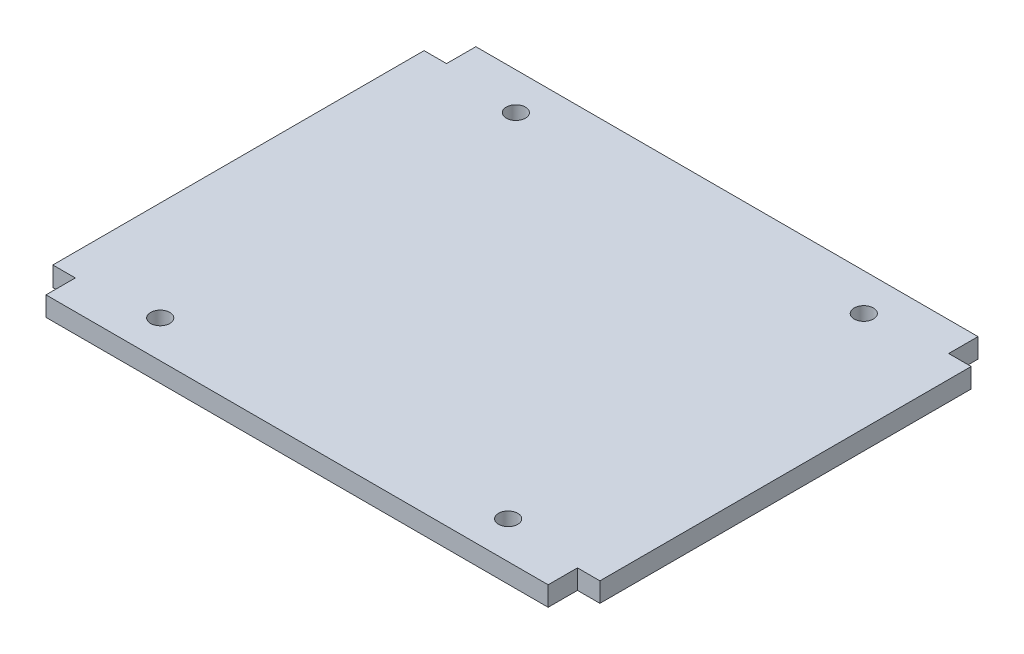
ISO-10303-21;
HEADER;
FILE_DESCRIPTION(('STEP AP214'),'2;1');
FILE_NAME('part.step','',(''),(''),'','','');
FILE_SCHEMA(('AUTOMOTIVE_DESIGN { 1 0 10303 214 1 1 1 1 }'));
ENDSEC;
DATA;
#1=APPLICATION_CONTEXT('core data for automotive mechanical design processes');
#2=APPLICATION_PROTOCOL_DEFINITION('international standard','automotive_design',2000,#1);
#3=PRODUCT_CONTEXT('',#1,'mechanical');
#4=PRODUCT('Part','Part','',(#3));
#5=PRODUCT_RELATED_PRODUCT_CATEGORY('part','',(#4));
#6=PRODUCT_DEFINITION_FORMATION('','',#4);
#7=PRODUCT_DEFINITION_CONTEXT('part definition',#1,'design');
#8=PRODUCT_DEFINITION('design','',#6,#7);
#9=PRODUCT_DEFINITION_SHAPE('','',#8);
#10=(LENGTH_UNIT() NAMED_UNIT(*) SI_UNIT(.MILLI.,.METRE.));
#11=(NAMED_UNIT(*) PLANE_ANGLE_UNIT() SI_UNIT($,.RADIAN.));
#12=(NAMED_UNIT(*) SI_UNIT($,.STERADIAN.) SOLID_ANGLE_UNIT());
#13=UNCERTAINTY_MEASURE_WITH_UNIT(LENGTH_MEASURE(1.E-05),#10,'distance_accuracy_value','');
#14=(GEOMETRIC_REPRESENTATION_CONTEXT(3) GLOBAL_UNCERTAINTY_ASSIGNED_CONTEXT((#13)) GLOBAL_UNIT_ASSIGNED_CONTEXT((#10,
#11,#12)) REPRESENTATION_CONTEXT('',''));
#15=CARTESIAN_POINT('',(0.,0.,0.));
#16=DIRECTION('',(0.,0.,1.));
#17=DIRECTION('',(1.,0.,0.));
#18=AXIS2_PLACEMENT_3D('',#15,#16,#17);
#19=CARTESIAN_POINT('',(0.,1.27,0.));
#20=DIRECTION('',(0.,-1.,0.));
#21=DIRECTION('',(0.,0.,-1.));
#22=AXIS2_PLACEMENT_3D('',#19,#20,#21);
#23=PLANE('',#22);
#24=DIRECTION('',(0.,0.,-1.));
#25=VECTOR('',#24,1.);
#26=CARTESIAN_POINT('',(32.639,1.27,-24.13));
#27=LINE('',#26,#25);
#28=CARTESIAN_POINT('',(32.639,1.27,-24.13));
#29=VERTEX_POINT('',#28);
#30=CARTESIAN_POINT('',(32.639,1.27,-27.94));
#31=VERTEX_POINT('',#30);
#32=EDGE_CURVE('E177',#29,#31,#27,.T.);
#33=ORIENTED_EDGE('',*,*,#32,.T.);
#34=DIRECTION('',(-1.,0.,0.));
#35=VECTOR('',#34,1.);
#36=CARTESIAN_POINT('',(-32.639,1.27,-27.94));
#37=LINE('',#36,#35);
#38=CARTESIAN_POINT('',(-32.639,1.27,-27.94));
#39=VERTEX_POINT('',#38);
#40=EDGE_CURVE('E105',#31,#39,#37,.T.);
#41=ORIENTED_EDGE('',*,*,#40,.T.);
#42=DIRECTION('',(0.,0.,1.));
#43=VECTOR('',#42,1.);
#44=CARTESIAN_POINT('',(-32.639,1.27,-24.13));
#45=LINE('',#44,#43);
#46=CARTESIAN_POINT('',(-32.639,1.27,-24.13));
#47=VERTEX_POINT('',#46);
#48=EDGE_CURVE('E204',#39,#47,#45,.T.);
#49=ORIENTED_EDGE('',*,*,#48,.T.);
#50=DIRECTION('',(-1.,0.,0.));
#51=VECTOR('',#50,1.);
#52=CARTESIAN_POINT('',(-32.639,1.27,-24.13));
#53=LINE('',#52,#51);
#54=CARTESIAN_POINT('',(-35.56,1.27,-24.13));
#55=VERTEX_POINT('',#54);
#56=EDGE_CURVE('E223',#47,#55,#53,.T.);
#57=ORIENTED_EDGE('',*,*,#56,.T.);
#58=DIRECTION('',(0.,0.,1.));
#59=VECTOR('',#58,1.);
#60=CARTESIAN_POINT('',(-35.56,1.27,-24.13));
#61=LINE('',#60,#59);
#62=CARTESIAN_POINT('',(-35.56,1.27,24.13));
#63=VERTEX_POINT('',#62);
#64=EDGE_CURVE('E220',#55,#63,#61,.T.);
#65=ORIENTED_EDGE('',*,*,#64,.T.);
#66=DIRECTION('',(1.,0.,0.));
#67=VECTOR('',#66,1.);
#68=CARTESIAN_POINT('',(-32.639,1.27,24.13));
#69=LINE('',#68,#67);
#70=CARTESIAN_POINT('',(-32.639,1.27,24.13));
#71=VERTEX_POINT('',#70);
#72=EDGE_CURVE('E222',#63,#71,#69,.T.);
#73=ORIENTED_EDGE('',*,*,#72,.T.);
#74=DIRECTION('',(0.,0.,1.));
#75=VECTOR('',#74,1.);
#76=CARTESIAN_POINT('',(-32.639,1.27,27.94));
#77=LINE('',#76,#75);
#78=CARTESIAN_POINT('',(-32.639,1.27,27.94));
#79=VERTEX_POINT('',#78);
#80=EDGE_CURVE('E225',#71,#79,#77,.T.);
#81=ORIENTED_EDGE('',*,*,#80,.T.);
#82=DIRECTION('',(1.,0.,0.));
#83=VECTOR('',#82,1.);
#84=CARTESIAN_POINT('',(-32.639,1.27,27.94));
#85=LINE('',#84,#83);
#86=CARTESIAN_POINT('',(32.639,1.27,27.94));
#87=VERTEX_POINT('',#86);
#88=EDGE_CURVE('E231',#79,#87,#85,.T.);
#89=ORIENTED_EDGE('',*,*,#88,.T.);
#90=DIRECTION('',(0.,0.,-1.));
#91=VECTOR('',#90,1.);
#92=CARTESIAN_POINT('',(32.639,1.27,27.94));
#93=LINE('',#92,#91);
#94=CARTESIAN_POINT('',(32.639,1.27,24.13));
#95=VERTEX_POINT('',#94);
#96=EDGE_CURVE('E136',#87,#95,#93,.T.);
#97=ORIENTED_EDGE('',*,*,#96,.T.);
#98=DIRECTION('',(1.,0.,0.));
#99=VECTOR('',#98,1.);
#100=CARTESIAN_POINT('',(32.639,1.27,24.13));
#101=LINE('',#100,#99);
#102=CARTESIAN_POINT('',(35.56,1.27,24.13));
#103=VERTEX_POINT('',#102);
#104=EDGE_CURVE('E130',#95,#103,#101,.T.);
#105=ORIENTED_EDGE('',*,*,#104,.T.);
#106=DIRECTION('',(0.,0.,-1.));
#107=VECTOR('',#106,1.);
#108=CARTESIAN_POINT('',(35.56,1.27,-24.13));
#109=LINE('',#108,#107);
#110=CARTESIAN_POINT('',(35.56,1.27,-24.13));
#111=VERTEX_POINT('',#110);
#112=EDGE_CURVE('E134',#103,#111,#109,.T.);
#113=ORIENTED_EDGE('',*,*,#112,.T.);
#114=DIRECTION('',(-1.,0.,0.));
#115=VECTOR('',#114,1.);
#116=CARTESIAN_POINT('',(32.639,1.27,-24.13));
#117=LINE('',#116,#115);
#118=EDGE_CURVE('E50',#111,#29,#117,.T.);
#119=ORIENTED_EDGE('',*,*,#118,.T.);
#120=EDGE_LOOP('',(#33,#41,#49,#57,#65,#73,#81,#89,#97,#105,#113,#119));
#121=FACE_BOUND('',#120,.T.);
#122=CARTESIAN_POINT('',(-22.615,1.27,-23.115));
#123=DIRECTION('',(0.,1.,0.));
#124=DIRECTION('',(0.,0.,1.));
#125=AXIS2_PLACEMENT_3D('',#122,#123,#124);
#126=CIRCLE('',#125,1.25);
#127=CARTESIAN_POINT('',(-22.615,1.27,-21.865));
#128=VERTEX_POINT('',#127);
#129=EDGE_CURVE('E158',#128,#128,#126,.T.);
#130=ORIENTED_EDGE('',*,*,#129,.F.);
#131=EDGE_LOOP('',(#130));
#132=FACE_BOUND('',#131,.T.);
#133=CARTESIAN_POINT('',(22.615,1.27,-23.115));
#134=DIRECTION('',(0.,1.,0.));
#135=DIRECTION('',(0.,0.,1.));
#136=AXIS2_PLACEMENT_3D('',#133,#134,#135);
#137=CIRCLE('',#136,1.25);
#138=CARTESIAN_POINT('',(22.615,1.27,-21.865));
#139=VERTEX_POINT('',#138);
#140=EDGE_CURVE('E295',#139,#139,#137,.T.);
#141=ORIENTED_EDGE('',*,*,#140,.F.);
#142=EDGE_LOOP('',(#141));
#143=FACE_BOUND('',#142,.T.);
#144=CARTESIAN_POINT('',(22.615,1.27,23.115));
#145=DIRECTION('',(0.,1.,0.));
#146=DIRECTION('',(0.,0.,-1.));
#147=AXIS2_PLACEMENT_3D('',#144,#145,#146);
#148=CIRCLE('',#147,1.25);
#149=CARTESIAN_POINT('',(22.615,1.27,21.865));
#150=VERTEX_POINT('',#149);
#151=EDGE_CURVE('E289',#150,#150,#148,.T.);
#152=ORIENTED_EDGE('',*,*,#151,.F.);
#153=EDGE_LOOP('',(#152));
#154=FACE_BOUND('',#153,.T.);
#155=CARTESIAN_POINT('',(-22.615,1.27,23.115));
#156=DIRECTION('',(0.,1.,0.));
#157=DIRECTION('',(0.,0.,-1.));
#158=AXIS2_PLACEMENT_3D('',#155,#156,#157);
#159=CIRCLE('',#158,1.25);
#160=CARTESIAN_POINT('',(-22.615,1.27,21.865));
#161=VERTEX_POINT('',#160);
#162=EDGE_CURVE('E280',#161,#161,#159,.T.);
#163=ORIENTED_EDGE('',*,*,#162,.F.);
#164=EDGE_LOOP('',(#163));
#165=FACE_BOUND('',#164,.T.);
#166=ADVANCED_FACE('F33',(#121,#132,#143,#154,#165),#23,.F.);
#167=CARTESIAN_POINT('',(0.,-1.27,0.));
#168=DIRECTION('',(0.,-1.,0.));
#169=DIRECTION('',(0.,0.,-1.));
#170=AXIS2_PLACEMENT_3D('',#167,#168,#169);
#171=PLANE('',#170);
#172=CARTESIAN_POINT('',(22.615,-1.27,23.115));
#173=DIRECTION('',(0.,1.,0.));
#174=DIRECTION('',(0.,0.,-1.));
#175=AXIS2_PLACEMENT_3D('',#172,#173,#174);
#176=CIRCLE('',#175,1.25);
#177=CARTESIAN_POINT('',(22.615,-1.27,21.865));
#178=VERTEX_POINT('',#177);
#179=EDGE_CURVE('E286',#178,#178,#176,.T.);
#180=ORIENTED_EDGE('',*,*,#179,.T.);
#181=EDGE_LOOP('',(#180));
#182=FACE_BOUND('',#181,.T.);
#183=CARTESIAN_POINT('',(-22.615,-1.27,-23.115));
#184=DIRECTION('',(0.,1.,0.));
#185=DIRECTION('',(0.,0.,1.));
#186=AXIS2_PLACEMENT_3D('',#183,#184,#185);
#187=CIRCLE('',#186,1.25);
#188=CARTESIAN_POINT('',(-22.615,-1.27,-21.865));
#189=VERTEX_POINT('',#188);
#190=EDGE_CURVE('E298',#189,#189,#187,.T.);
#191=ORIENTED_EDGE('',*,*,#190,.T.);
#192=EDGE_LOOP('',(#191));
#193=FACE_BOUND('',#192,.T.);
#194=DIRECTION('',(0.,0.,-1.));
#195=VECTOR('',#194,1.);
#196=CARTESIAN_POINT('',(32.639,-1.27,-24.13));
#197=LINE('',#196,#195);
#198=CARTESIAN_POINT('',(32.639,-1.27,-24.13));
#199=VERTEX_POINT('',#198);
#200=CARTESIAN_POINT('',(32.639,-1.27,-27.94));
#201=VERTEX_POINT('',#200);
#202=EDGE_CURVE('E154',#199,#201,#197,.T.);
#203=ORIENTED_EDGE('',*,*,#202,.F.);
#204=DIRECTION('',(-1.,0.,0.));
#205=VECTOR('',#204,1.);
#206=CARTESIAN_POINT('',(32.639,-1.27,-24.13));
#207=LINE('',#206,#205);
#208=CARTESIAN_POINT('',(35.56,-1.27,-24.13));
#209=VERTEX_POINT('',#208);
#210=EDGE_CURVE('E97',#209,#199,#207,.T.);
#211=ORIENTED_EDGE('',*,*,#210,.F.);
#212=DIRECTION('',(0.,0.,-1.));
#213=VECTOR('',#212,1.);
#214=CARTESIAN_POINT('',(35.56,-1.27,-24.13));
#215=LINE('',#214,#213);
#216=CARTESIAN_POINT('',(35.56,-1.27,24.13));
#217=VERTEX_POINT('',#216);
#218=EDGE_CURVE('E91',#217,#209,#215,.T.);
#219=ORIENTED_EDGE('',*,*,#218,.F.);
#220=DIRECTION('',(1.,0.,0.));
#221=VECTOR('',#220,1.);
#222=CARTESIAN_POINT('',(32.639,-1.27,24.13));
#223=LINE('',#222,#221);
#224=CARTESIAN_POINT('',(32.639,-1.27,24.13));
#225=VERTEX_POINT('',#224);
#226=EDGE_CURVE('E144',#225,#217,#223,.T.);
#227=ORIENTED_EDGE('',*,*,#226,.F.);
#228=DIRECTION('',(0.,0.,-1.));
#229=VECTOR('',#228,1.);
#230=CARTESIAN_POINT('',(32.639,-1.27,27.94));
#231=LINE('',#230,#229);
#232=CARTESIAN_POINT('',(32.639,-1.27,27.94));
#233=VERTEX_POINT('',#232);
#234=EDGE_CURVE('E172',#233,#225,#231,.T.);
#235=ORIENTED_EDGE('',*,*,#234,.F.);
#236=DIRECTION('',(1.,0.,0.));
#237=VECTOR('',#236,1.);
#238=CARTESIAN_POINT('',(-32.639,-1.27,27.94));
#239=LINE('',#238,#237);
#240=CARTESIAN_POINT('',(-32.639,-1.27,27.94));
#241=VERTEX_POINT('',#240);
#242=EDGE_CURVE('E170',#241,#233,#239,.T.);
#243=ORIENTED_EDGE('',*,*,#242,.F.);
#244=DIRECTION('',(0.,0.,1.));
#245=VECTOR('',#244,1.);
#246=CARTESIAN_POINT('',(-32.639,-1.27,27.94));
#247=LINE('',#246,#245);
#248=CARTESIAN_POINT('',(-32.639,-1.27,24.13));
#249=VERTEX_POINT('',#248);
#250=EDGE_CURVE('E168',#249,#241,#247,.T.);
#251=ORIENTED_EDGE('',*,*,#250,.F.);
#252=DIRECTION('',(1.,0.,0.));
#253=VECTOR('',#252,1.);
#254=CARTESIAN_POINT('',(-32.639,-1.27,24.13));
#255=LINE('',#254,#253);
#256=CARTESIAN_POINT('',(-35.56,-1.27,24.13));
#257=VERTEX_POINT('',#256);
#258=EDGE_CURVE('E166',#257,#249,#255,.T.);
#259=ORIENTED_EDGE('',*,*,#258,.F.);
#260=DIRECTION('',(0.,0.,1.));
#261=VECTOR('',#260,1.);
#262=CARTESIAN_POINT('',(-35.56,-1.27,-24.13));
#263=LINE('',#262,#261);
#264=CARTESIAN_POINT('',(-35.56,-1.27,-24.13));
#265=VERTEX_POINT('',#264);
#266=EDGE_CURVE('E164',#265,#257,#263,.T.);
#267=ORIENTED_EDGE('',*,*,#266,.F.);
#268=DIRECTION('',(-1.,0.,0.));
#269=VECTOR('',#268,1.);
#270=CARTESIAN_POINT('',(-32.639,-1.27,-24.13));
#271=LINE('',#270,#269);
#272=CARTESIAN_POINT('',(-32.639,-1.27,-24.13));
#273=VERTEX_POINT('',#272);
#274=EDGE_CURVE('E162',#273,#265,#271,.T.);
#275=ORIENTED_EDGE('',*,*,#274,.F.);
#276=DIRECTION('',(0.,0.,1.));
#277=VECTOR('',#276,1.);
#278=CARTESIAN_POINT('',(-32.639,-1.27,-24.13));
#279=LINE('',#278,#277);
#280=CARTESIAN_POINT('',(-32.639,-1.27,-27.94));
#281=VERTEX_POINT('',#280);
#282=EDGE_CURVE('E160',#281,#273,#279,.T.);
#283=ORIENTED_EDGE('',*,*,#282,.F.);
#284=DIRECTION('',(-1.,0.,0.));
#285=VECTOR('',#284,1.);
#286=CARTESIAN_POINT('',(-32.639,-1.27,-27.94));
#287=LINE('',#286,#285);
#288=EDGE_CURVE('E157',#201,#281,#287,.T.);
#289=ORIENTED_EDGE('',*,*,#288,.F.);
#290=EDGE_LOOP('',(#203,#211,#219,#227,#235,#243,#251,#259,#267,#275,#283,#289));
#291=FACE_BOUND('',#290,.T.);
#292=CARTESIAN_POINT('',(22.615,-1.27,-23.115));
#293=DIRECTION('',(0.,1.,0.));
#294=DIRECTION('',(0.,0.,1.));
#295=AXIS2_PLACEMENT_3D('',#292,#293,#294);
#296=CIRCLE('',#295,1.25);
#297=CARTESIAN_POINT('',(22.615,-1.27,-21.865));
#298=VERTEX_POINT('',#297);
#299=EDGE_CURVE('E292',#298,#298,#296,.T.);
#300=ORIENTED_EDGE('',*,*,#299,.T.);
#301=EDGE_LOOP('',(#300));
#302=FACE_BOUND('',#301,.T.);
#303=CARTESIAN_POINT('',(-22.615,-1.27,23.115));
#304=DIRECTION('',(0.,1.,0.));
#305=DIRECTION('',(0.,0.,-1.));
#306=AXIS2_PLACEMENT_3D('',#303,#304,#305);
#307=CIRCLE('',#306,1.25);
#308=CARTESIAN_POINT('',(-22.615,-1.27,21.865));
#309=VERTEX_POINT('',#308);
#310=EDGE_CURVE('E283',#309,#309,#307,.T.);
#311=ORIENTED_EDGE('',*,*,#310,.T.);
#312=EDGE_LOOP('',(#311));
#313=FACE_BOUND('',#312,.T.);
#314=ADVANCED_FACE('F208',(#182,#193,#291,#302,#313),#171,.T.);
#315=CARTESIAN_POINT('',(32.639,1.27,-24.13));
#316=DIRECTION('',(-1.,0.,0.));
#317=DIRECTION('',(0.,0.,1.));
#318=AXIS2_PLACEMENT_3D('',#315,#316,#317);
#319=PLANE('',#318);
#320=ORIENTED_EDGE('',*,*,#202,.T.);
#321=DIRECTION('',(0.,-1.,0.));
#322=VECTOR('',#321,1.);
#323=CARTESIAN_POINT('',(32.639,1.27,-27.94));
#324=LINE('',#323,#322);
#325=EDGE_CURVE('E11',#31,#201,#324,.T.);
#326=ORIENTED_EDGE('',*,*,#325,.F.);
#327=ORIENTED_EDGE('',*,*,#32,.F.);
#328=DIRECTION('',(0.,-1.,0.));
#329=VECTOR('',#328,1.);
#330=CARTESIAN_POINT('',(32.639,1.27,-24.13));
#331=LINE('',#330,#329);
#332=EDGE_CURVE('E150',#29,#199,#331,.T.);
#333=ORIENTED_EDGE('',*,*,#332,.T.);
#334=EDGE_LOOP('',(#320,#326,#327,#333));
#335=FACE_BOUND('',#334,.T.);
#336=ADVANCED_FACE('F35',(#335),#319,.F.);
#337=CARTESIAN_POINT('',(-32.639,1.27,-27.94));
#338=DIRECTION('',(0.,0.,1.));
#339=DIRECTION('',(1.,0.,0.));
#340=AXIS2_PLACEMENT_3D('',#337,#338,#339);
#341=PLANE('',#340);
#342=ORIENTED_EDGE('',*,*,#288,.T.);
#343=DIRECTION('',(0.,-1.,0.));
#344=VECTOR('',#343,1.);
#345=CARTESIAN_POINT('',(-32.639,1.27,-27.94));
#346=LINE('',#345,#344);
#347=EDGE_CURVE('E42',#39,#281,#346,.T.);
#348=ORIENTED_EDGE('',*,*,#347,.F.);
#349=ORIENTED_EDGE('',*,*,#40,.F.);
#350=ORIENTED_EDGE('',*,*,#325,.T.);
#351=EDGE_LOOP('',(#342,#348,#349,#350));
#352=FACE_BOUND('',#351,.T.);
#353=ADVANCED_FACE('F410',(#352),#341,.F.);
#354=CARTESIAN_POINT('',(-32.639,1.27,-24.13));
#355=DIRECTION('',(1.,0.,0.));
#356=DIRECTION('',(0.,0.,-1.));
#357=AXIS2_PLACEMENT_3D('',#354,#355,#356);
#358=PLANE('',#357);
#359=ORIENTED_EDGE('',*,*,#282,.T.);
#360=DIRECTION('',(0.,-1.,0.));
#361=VECTOR('',#360,1.);
#362=CARTESIAN_POINT('',(-32.639,1.27,-24.13));
#363=LINE('',#362,#361);
#364=EDGE_CURVE('E196',#47,#273,#363,.T.);
#365=ORIENTED_EDGE('',*,*,#364,.F.);
#366=ORIENTED_EDGE('',*,*,#48,.F.);
#367=ORIENTED_EDGE('',*,*,#347,.T.);
#368=EDGE_LOOP('',(#359,#365,#366,#367));
#369=FACE_BOUND('',#368,.T.);
#370=ADVANCED_FACE('F202',(#369),#358,.F.);
#371=CARTESIAN_POINT('',(-32.639,1.27,-24.13));
#372=DIRECTION('',(0.,0.,1.));
#373=DIRECTION('',(1.,0.,0.));
#374=AXIS2_PLACEMENT_3D('',#371,#372,#373);
#375=PLANE('',#374);
#376=ORIENTED_EDGE('',*,*,#274,.T.);
#377=DIRECTION('',(0.,-1.,0.));
#378=VECTOR('',#377,1.);
#379=CARTESIAN_POINT('',(-35.56,1.27,-24.13));
#380=LINE('',#379,#378);
#381=EDGE_CURVE('E193',#55,#265,#380,.T.);
#382=ORIENTED_EDGE('',*,*,#381,.F.);
#383=ORIENTED_EDGE('',*,*,#56,.F.);
#384=ORIENTED_EDGE('',*,*,#364,.T.);
#385=EDGE_LOOP('',(#376,#382,#383,#384));
#386=FACE_BOUND('',#385,.T.);
#387=ADVANCED_FACE('F214',(#386),#375,.F.);
#388=CARTESIAN_POINT('',(-35.56,1.27,-24.13));
#389=DIRECTION('',(1.,0.,0.));
#390=DIRECTION('',(0.,0.,-1.));
#391=AXIS2_PLACEMENT_3D('',#388,#389,#390);
#392=PLANE('',#391);
#393=ORIENTED_EDGE('',*,*,#266,.T.);
#394=DIRECTION('',(0.,-1.,0.));
#395=VECTOR('',#394,1.);
#396=CARTESIAN_POINT('',(-35.56,1.27,24.13));
#397=LINE('',#396,#395);
#398=EDGE_CURVE('E190',#63,#257,#397,.T.);
#399=ORIENTED_EDGE('',*,*,#398,.F.);
#400=ORIENTED_EDGE('',*,*,#64,.F.);
#401=ORIENTED_EDGE('',*,*,#381,.T.);
#402=EDGE_LOOP('',(#393,#399,#400,#401));
#403=FACE_BOUND('',#402,.T.);
#404=ADVANCED_FACE('F218',(#403),#392,.F.);
#405=CARTESIAN_POINT('',(-32.639,1.27,24.13));
#406=DIRECTION('',(0.,0.,-1.));
#407=DIRECTION('',(-1.,0.,0.));
#408=AXIS2_PLACEMENT_3D('',#405,#406,#407);
#409=PLANE('',#408);
#410=ORIENTED_EDGE('',*,*,#258,.T.);
#411=DIRECTION('',(0.,-1.,0.));
#412=VECTOR('',#411,1.);
#413=CARTESIAN_POINT('',(-32.639,1.27,24.13));
#414=LINE('',#413,#412);
#415=EDGE_CURVE('E187',#71,#249,#414,.T.);
#416=ORIENTED_EDGE('',*,*,#415,.F.);
#417=ORIENTED_EDGE('',*,*,#72,.F.);
#418=ORIENTED_EDGE('',*,*,#398,.T.);
#419=EDGE_LOOP('',(#410,#416,#417,#418));
#420=FACE_BOUND('',#419,.T.);
#421=ADVANCED_FACE('F375',(#420),#409,.F.);
#422=CARTESIAN_POINT('',(-32.639,1.27,27.94));
#423=DIRECTION('',(1.,0.,0.));
#424=DIRECTION('',(0.,0.,-1.));
#425=AXIS2_PLACEMENT_3D('',#422,#423,#424);
#426=PLANE('',#425);
#427=ORIENTED_EDGE('',*,*,#250,.T.);
#428=DIRECTION('',(0.,-1.,0.));
#429=VECTOR('',#428,1.);
#430=CARTESIAN_POINT('',(-32.639,1.27,27.94));
#431=LINE('',#430,#429);
#432=EDGE_CURVE('E184',#79,#241,#431,.T.);
#433=ORIENTED_EDGE('',*,*,#432,.F.);
#434=ORIENTED_EDGE('',*,*,#80,.F.);
#435=ORIENTED_EDGE('',*,*,#415,.T.);
#436=EDGE_LOOP('',(#427,#433,#434,#435));
#437=FACE_BOUND('',#436,.T.);
#438=ADVANCED_FACE('F366',(#437),#426,.F.);
#439=CARTESIAN_POINT('',(-32.639,1.27,27.94));
#440=DIRECTION('',(0.,0.,-1.));
#441=DIRECTION('',(-1.,0.,0.));
#442=AXIS2_PLACEMENT_3D('',#439,#440,#441);
#443=PLANE('',#442);
#444=ORIENTED_EDGE('',*,*,#242,.T.);
#445=DIRECTION('',(0.,-1.,0.));
#446=VECTOR('',#445,1.);
#447=CARTESIAN_POINT('',(32.639,1.27,27.94));
#448=LINE('',#447,#446);
#449=EDGE_CURVE('E181',#87,#233,#448,.T.);
#450=ORIENTED_EDGE('',*,*,#449,.F.);
#451=ORIENTED_EDGE('',*,*,#88,.F.);
#452=ORIENTED_EDGE('',*,*,#432,.T.);
#453=EDGE_LOOP('',(#444,#450,#451,#452));
#454=FACE_BOUND('',#453,.T.);
#455=ADVANCED_FACE('F237',(#454),#443,.F.);
#456=CARTESIAN_POINT('',(32.639,1.27,27.94));
#457=DIRECTION('',(-1.,0.,0.));
#458=DIRECTION('',(0.,0.,1.));
#459=AXIS2_PLACEMENT_3D('',#456,#457,#458);
#460=PLANE('',#459);
#461=ORIENTED_EDGE('',*,*,#234,.T.);
#462=DIRECTION('',(0.,-1.,0.));
#463=VECTOR('',#462,1.);
#464=CARTESIAN_POINT('',(32.639,1.27,24.13));
#465=LINE('',#464,#463);
#466=EDGE_CURVE('E145',#95,#225,#465,.T.);
#467=ORIENTED_EDGE('',*,*,#466,.F.);
#468=ORIENTED_EDGE('',*,*,#96,.F.);
#469=ORIENTED_EDGE('',*,*,#449,.T.);
#470=EDGE_LOOP('',(#461,#467,#468,#469));
#471=FACE_BOUND('',#470,.T.);
#472=ADVANCED_FACE('F241',(#471),#460,.F.);
#473=CARTESIAN_POINT('',(32.639,1.27,24.13));
#474=DIRECTION('',(0.,0.,-1.));
#475=DIRECTION('',(-1.,0.,0.));
#476=AXIS2_PLACEMENT_3D('',#473,#474,#475);
#477=PLANE('',#476);
#478=ORIENTED_EDGE('',*,*,#226,.T.);
#479=DIRECTION('',(0.,-1.,0.));
#480=VECTOR('',#479,1.);
#481=CARTESIAN_POINT('',(35.56,1.27,24.13));
#482=LINE('',#481,#480);
#483=EDGE_CURVE('E141',#103,#217,#482,.T.);
#484=ORIENTED_EDGE('',*,*,#483,.F.);
#485=ORIENTED_EDGE('',*,*,#104,.F.);
#486=ORIENTED_EDGE('',*,*,#466,.T.);
#487=EDGE_LOOP('',(#478,#484,#485,#486));
#488=FACE_BOUND('',#487,.T.);
#489=ADVANCED_FACE('F142',(#488),#477,.F.);
#490=CARTESIAN_POINT('',(35.56,1.27,-24.13));
#491=DIRECTION('',(-1.,0.,0.));
#492=DIRECTION('',(0.,0.,1.));
#493=AXIS2_PLACEMENT_3D('',#490,#491,#492);
#494=PLANE('',#493);
#495=ORIENTED_EDGE('',*,*,#218,.T.);
#496=DIRECTION('',(0.,-1.,0.));
#497=VECTOR('',#496,1.);
#498=CARTESIAN_POINT('',(35.56,1.27,-24.13));
#499=LINE('',#498,#497);
#500=EDGE_CURVE('E146',#111,#209,#499,.T.);
#501=ORIENTED_EDGE('',*,*,#500,.F.);
#502=ORIENTED_EDGE('',*,*,#112,.F.);
#503=ORIENTED_EDGE('',*,*,#483,.T.);
#504=EDGE_LOOP('',(#495,#501,#502,#503));
#505=FACE_BOUND('',#504,.T.);
#506=ADVANCED_FACE('F148',(#505),#494,.F.);
#507=CARTESIAN_POINT('',(32.639,1.27,-24.13));
#508=DIRECTION('',(0.,0.,1.));
#509=DIRECTION('',(1.,0.,0.));
#510=AXIS2_PLACEMENT_3D('',#507,#508,#509);
#511=PLANE('',#510);
#512=ORIENTED_EDGE('',*,*,#210,.T.);
#513=ORIENTED_EDGE('',*,*,#332,.F.);
#514=ORIENTED_EDGE('',*,*,#118,.F.);
#515=ORIENTED_EDGE('',*,*,#500,.T.);
#516=EDGE_LOOP('',(#512,#513,#514,#515));
#517=FACE_BOUND('',#516,.T.);
#518=ADVANCED_FACE('F245',(#517),#511,.F.);
#519=CARTESIAN_POINT('',(-22.615,1.27,-23.115));
#520=DIRECTION('',(0.,-1.,0.));
#521=DIRECTION('',(0.,0.,-1.));
#522=AXIS2_PLACEMENT_3D('',#519,#520,#521);
#523=CYLINDRICAL_SURFACE('',#522,1.25);
#524=ORIENTED_EDGE('',*,*,#129,.T.);
#525=EDGE_LOOP('',(#524));
#526=FACE_BOUND('',#525,.T.);
#527=ORIENTED_EDGE('',*,*,#190,.F.);
#528=EDGE_LOOP('',(#527));
#529=FACE_BOUND('',#528,.T.);
#530=ADVANCED_FACE('F247',(#526,#529),#523,.F.);
#531=CARTESIAN_POINT('',(22.615,1.27,-23.115));
#532=DIRECTION('',(0.,-1.,0.));
#533=DIRECTION('',(0.,0.,-1.));
#534=AXIS2_PLACEMENT_3D('',#531,#532,#533);
#535=CYLINDRICAL_SURFACE('',#534,1.25);
#536=ORIENTED_EDGE('',*,*,#140,.T.);
#537=EDGE_LOOP('',(#536));
#538=FACE_BOUND('',#537,.T.);
#539=ORIENTED_EDGE('',*,*,#299,.F.);
#540=EDGE_LOOP('',(#539));
#541=FACE_BOUND('',#540,.T.);
#542=ADVANCED_FACE('F253',(#538,#541),#535,.F.);
#543=CARTESIAN_POINT('',(22.615,1.27,23.115));
#544=DIRECTION('',(0.,-1.,0.));
#545=DIRECTION('',(0.,0.,-1.));
#546=AXIS2_PLACEMENT_3D('',#543,#544,#545);
#547=CYLINDRICAL_SURFACE('',#546,1.25);
#548=ORIENTED_EDGE('',*,*,#151,.T.);
#549=EDGE_LOOP('',(#548));
#550=FACE_BOUND('',#549,.T.);
#551=ORIENTED_EDGE('',*,*,#179,.F.);
#552=EDGE_LOOP('',(#551));
#553=FACE_BOUND('',#552,.T.);
#554=ADVANCED_FACE('F267',(#550,#553),#547,.F.);
#555=CARTESIAN_POINT('',(-22.615,1.27,23.115));
#556=DIRECTION('',(0.,-1.,0.));
#557=DIRECTION('',(0.,0.,-1.));
#558=AXIS2_PLACEMENT_3D('',#555,#556,#557);
#559=CYLINDRICAL_SURFACE('',#558,1.25);
#560=ORIENTED_EDGE('',*,*,#162,.T.);
#561=EDGE_LOOP('',(#560));
#562=FACE_BOUND('',#561,.T.);
#563=ORIENTED_EDGE('',*,*,#310,.F.);
#564=EDGE_LOOP('',(#563));
#565=FACE_BOUND('',#564,.T.);
#566=ADVANCED_FACE('F271',(#562,#565),#559,.F.);
#567=CLOSED_SHELL('',(#166,#314,#336,#353,#370,#387,#404,#421,#438,#455,#472,#489,#506,#518,
#530,#542,#554,#566));
#568=MANIFOLD_SOLID_BREP('B2',#567);
#569=ADVANCED_BREP_SHAPE_REPRESENTATION('',(#18,#568),#14);
#570=SHAPE_DEFINITION_REPRESENTATION(#9,#569);
ENDSEC;
END-ISO-10303-21;
